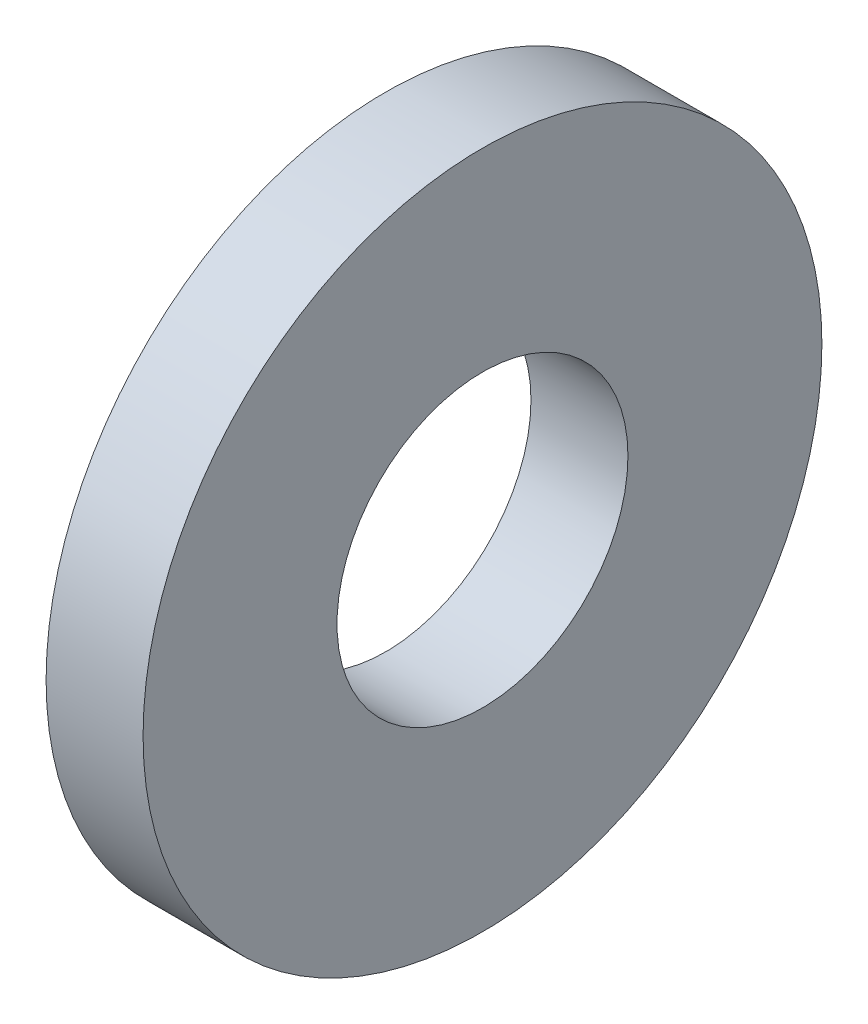
ISO-10303-21;
HEADER;
FILE_DESCRIPTION(('STEP AP214'),'2;1');
FILE_NAME('part.step','',(''),(''),'','','');
FILE_SCHEMA(('AUTOMOTIVE_DESIGN { 1 0 10303 214 1 1 1 1 }'));
ENDSEC;
DATA;
#1=APPLICATION_CONTEXT('core data for automotive mechanical design processes');
#2=APPLICATION_PROTOCOL_DEFINITION('international standard','automotive_design',2000,#1);
#3=PRODUCT_CONTEXT('',#1,'mechanical');
#4=PRODUCT('Part','Part','',(#3));
#5=PRODUCT_RELATED_PRODUCT_CATEGORY('part','',(#4));
#6=PRODUCT_DEFINITION_FORMATION('','',#4);
#7=PRODUCT_DEFINITION_CONTEXT('part definition',#1,'design');
#8=PRODUCT_DEFINITION('design','',#6,#7);
#9=PRODUCT_DEFINITION_SHAPE('','',#8);
#10=(LENGTH_UNIT() NAMED_UNIT(*) SI_UNIT(.MILLI.,.METRE.));
#11=(NAMED_UNIT(*) PLANE_ANGLE_UNIT() SI_UNIT($,.RADIAN.));
#12=(NAMED_UNIT(*) SI_UNIT($,.STERADIAN.) SOLID_ANGLE_UNIT());
#13=UNCERTAINTY_MEASURE_WITH_UNIT(LENGTH_MEASURE(1.E-05),#10,'distance_accuracy_value','');
#14=(GEOMETRIC_REPRESENTATION_CONTEXT(3) GLOBAL_UNCERTAINTY_ASSIGNED_CONTEXT((#13)) GLOBAL_UNIT_ASSIGNED_CONTEXT((#10,
#11,#12)) REPRESENTATION_CONTEXT('',''));
#15=CARTESIAN_POINT('',(0.,0.,0.));
#16=DIRECTION('',(0.,0.,1.));
#17=DIRECTION('',(1.,0.,0.));
#18=AXIS2_PLACEMENT_3D('',#15,#16,#17);
#19=CARTESIAN_POINT('',(3.175,0.,0.));
#20=DIRECTION('',(1.,0.,0.));
#21=DIRECTION('',(0.,0.,-1.));
#22=AXIS2_PLACEMENT_3D('',#19,#20,#21);
#23=PLANE('',#22);
#24=CARTESIAN_POINT('',(3.175,0.,0.));
#25=DIRECTION('',(1.,0.,0.));
#26=DIRECTION('',(0.,0.,-1.));
#27=AXIS2_PLACEMENT_3D('',#24,#25,#26);
#28=CIRCLE('',#27,11.1125);
#29=CARTESIAN_POINT('',(3.175,0.,-11.1125));
#30=VERTEX_POINT('',#29);
#31=EDGE_CURVE('E10',#30,#30,#28,.T.);
#32=ORIENTED_EDGE('',*,*,#31,.T.);
#33=EDGE_LOOP('',(#32));
#34=FACE_BOUND('',#33,.T.);
#35=CARTESIAN_POINT('',(3.175,0.,0.));
#36=DIRECTION('',(1.,0.,0.));
#37=DIRECTION('',(0.,0.,-1.));
#38=AXIS2_PLACEMENT_3D('',#35,#36,#37);
#39=CIRCLE('',#38,4.7625);
#40=CARTESIAN_POINT('',(3.175,0.,-4.7625));
#41=VERTEX_POINT('',#40);
#42=EDGE_CURVE('E50',#41,#41,#39,.T.);
#43=ORIENTED_EDGE('',*,*,#42,.F.);
#44=EDGE_LOOP('',(#43));
#45=FACE_BOUND('',#44,.T.);
#46=ADVANCED_FACE('F37',(#34,#45),#23,.T.);
#47=CARTESIAN_POINT('',(0.,0.,0.));
#48=DIRECTION('',(1.,0.,0.));
#49=DIRECTION('',(0.,0.,-1.));
#50=AXIS2_PLACEMENT_3D('',#47,#48,#49);
#51=PLANE('',#50);
#52=CARTESIAN_POINT('',(0.,0.,0.));
#53=DIRECTION('',(1.,0.,0.));
#54=DIRECTION('',(0.,0.,-1.));
#55=AXIS2_PLACEMENT_3D('',#52,#53,#54);
#56=CIRCLE('',#55,11.1125);
#57=CARTESIAN_POINT('',(0.,0.,-11.1125));
#58=VERTEX_POINT('',#57);
#59=EDGE_CURVE('E41',#58,#58,#56,.T.);
#60=ORIENTED_EDGE('',*,*,#59,.F.);
#61=EDGE_LOOP('',(#60));
#62=FACE_BOUND('',#61,.T.);
#63=CARTESIAN_POINT('',(0.,0.,0.));
#64=DIRECTION('',(1.,0.,0.));
#65=DIRECTION('',(0.,0.,-1.));
#66=AXIS2_PLACEMENT_3D('',#63,#64,#65);
#67=CIRCLE('',#66,4.7625);
#68=CARTESIAN_POINT('',(0.,0.,-4.7625));
#69=VERTEX_POINT('',#68);
#70=EDGE_CURVE('E52',#69,#69,#67,.T.);
#71=ORIENTED_EDGE('',*,*,#70,.T.);
#72=EDGE_LOOP('',(#71));
#73=FACE_BOUND('',#72,.T.);
#74=ADVANCED_FACE('F64',(#62,#73),#51,.F.);
#75=CARTESIAN_POINT('',(3.175,0.,0.));
#76=DIRECTION('',(-1.,0.,0.));
#77=DIRECTION('',(0.,0.,1.));
#78=AXIS2_PLACEMENT_3D('',#75,#76,#77);
#79=CYLINDRICAL_SURFACE('',#78,11.1125);
#80=ORIENTED_EDGE('',*,*,#31,.F.);
#81=EDGE_LOOP('',(#80));
#82=FACE_BOUND('',#81,.T.);
#83=ORIENTED_EDGE('',*,*,#59,.T.);
#84=EDGE_LOOP('',(#83));
#85=FACE_BOUND('',#84,.T.);
#86=ADVANCED_FACE('F39',(#82,#85),#79,.T.);
#87=CARTESIAN_POINT('',(3.175,0.,0.));
#88=DIRECTION('',(-1.,0.,0.));
#89=DIRECTION('',(0.,0.,1.));
#90=AXIS2_PLACEMENT_3D('',#87,#88,#89);
#91=CYLINDRICAL_SURFACE('',#90,4.7625);
#92=ORIENTED_EDGE('',*,*,#42,.T.);
#93=EDGE_LOOP('',(#92));
#94=FACE_BOUND('',#93,.T.);
#95=ORIENTED_EDGE('',*,*,#70,.F.);
#96=EDGE_LOOP('',(#95));
#97=FACE_BOUND('',#96,.T.);
#98=ADVANCED_FACE('F60',(#94,#97),#91,.F.);
#99=CLOSED_SHELL('',(#46,#74,#86,#98));
#100=MANIFOLD_SOLID_BREP('B2',#99);
#101=ADVANCED_BREP_SHAPE_REPRESENTATION('',(#18,#100),#14);
#102=SHAPE_DEFINITION_REPRESENTATION(#9,#101);
ENDSEC;
END-ISO-10303-21;
